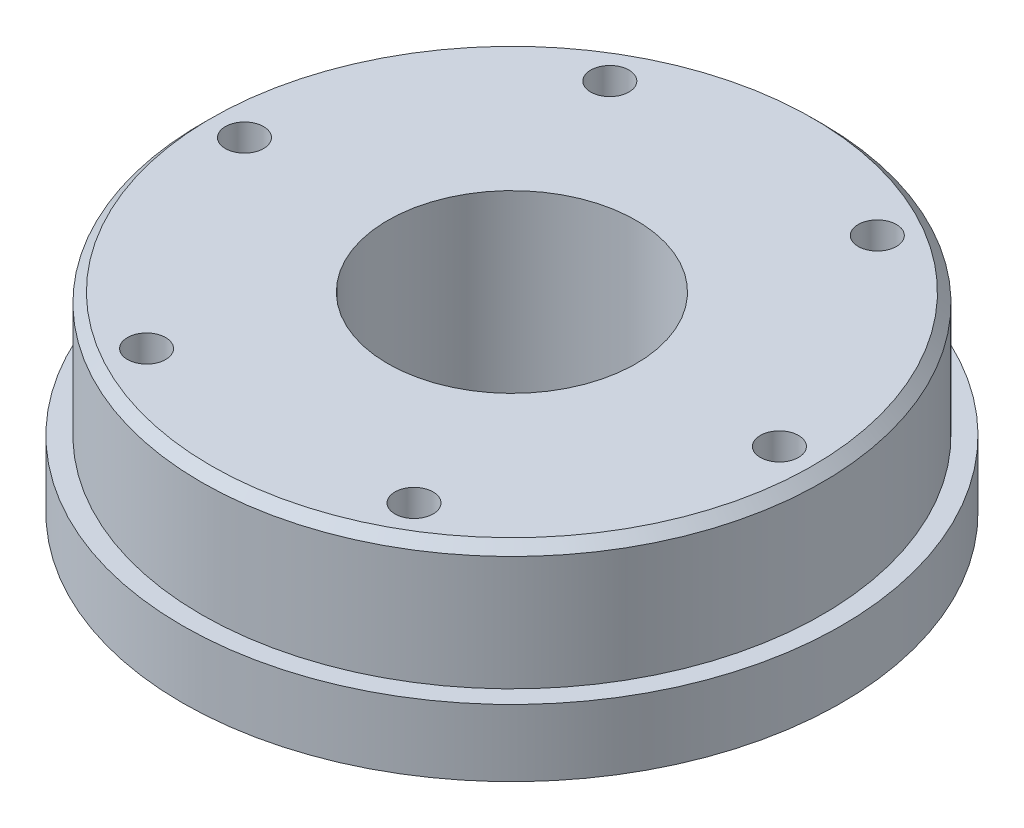
ISO-10303-21;
HEADER;
FILE_DESCRIPTION(('STEP AP214'),'2;1');
FILE_NAME('part.step','',(''),(''),'','','');
FILE_SCHEMA(('AUTOMOTIVE_DESIGN { 1 0 10303 214 1 1 1 1 }'));
ENDSEC;
DATA;
#1=APPLICATION_CONTEXT('core data for automotive mechanical design processes');
#2=APPLICATION_PROTOCOL_DEFINITION('international standard','automotive_design',2000,#1);
#3=PRODUCT_CONTEXT('',#1,'mechanical');
#4=PRODUCT('Part','Part','',(#3));
#5=PRODUCT_RELATED_PRODUCT_CATEGORY('part','',(#4));
#6=PRODUCT_DEFINITION_FORMATION('','',#4);
#7=PRODUCT_DEFINITION_CONTEXT('part definition',#1,'design');
#8=PRODUCT_DEFINITION('design','',#6,#7);
#9=PRODUCT_DEFINITION_SHAPE('','',#8);
#10=(LENGTH_UNIT() NAMED_UNIT(*) SI_UNIT(.MILLI.,.METRE.));
#11=(NAMED_UNIT(*) PLANE_ANGLE_UNIT() SI_UNIT($,.RADIAN.));
#12=(NAMED_UNIT(*) SI_UNIT($,.STERADIAN.) SOLID_ANGLE_UNIT());
#13=UNCERTAINTY_MEASURE_WITH_UNIT(LENGTH_MEASURE(1.E-05),#10,'distance_accuracy_value','');
#14=(GEOMETRIC_REPRESENTATION_CONTEXT(3) GLOBAL_UNCERTAINTY_ASSIGNED_CONTEXT((#13)) GLOBAL_UNIT_ASSIGNED_CONTEXT((#10,
#11,#12)) REPRESENTATION_CONTEXT('',''));
#15=CARTESIAN_POINT('',(0.,0.,0.));
#16=DIRECTION('',(0.,0.,1.));
#17=DIRECTION('',(1.,0.,0.));
#18=AXIS2_PLACEMENT_3D('',#15,#16,#17);
#19=CARTESIAN_POINT('',(-13.9999999999999,0.,-24.2487113059643));
#20=DIRECTION('',(0.,1.,0.));
#21=DIRECTION('',(0.,0.,1.));
#22=AXIS2_PLACEMENT_3D('',#19,#20,#21);
#23=CYLINDRICAL_SURFACE('',#22,2.);
#24=CARTESIAN_POINT('',(-13.9999999999999,20.,-24.2487113059643));
#25=DIRECTION('',(0.,1.,0.));
#26=DIRECTION('',(0.,0.,1.));
#27=AXIS2_PLACEMENT_3D('',#24,#25,#26);
#28=CIRCLE('',#27,2.);
#29=CARTESIAN_POINT('',(-13.9999999999999,20.,-22.2487113059643));
#30=VERTEX_POINT('',#29);
#31=EDGE_CURVE('E93',#30,#30,#28,.T.);
#32=ORIENTED_EDGE('',*,*,#31,.T.);
#33=EDGE_LOOP('',(#32));
#34=FACE_BOUND('',#33,.T.);
#35=CARTESIAN_POINT('',(-13.9999999999999,4.5,-24.2487113059643));
#36=DIRECTION('',(0.,-1.,0.));
#37=DIRECTION('',(0.,0.,-1.));
#38=AXIS2_PLACEMENT_3D('',#35,#36,#37);
#39=CIRCLE('',#38,2.);
#40=CARTESIAN_POINT('',(-13.9999999999999,4.5,-26.2487113059643));
#41=VERTEX_POINT('',#40);
#42=EDGE_CURVE('E57',#41,#41,#39,.F.);
#43=ORIENTED_EDGE('',*,*,#42,.F.);
#44=EDGE_LOOP('',(#43));
#45=FACE_BOUND('',#44,.T.);
#46=ADVANCED_FACE('F38',(#34,#45),#23,.F.);
#47=CARTESIAN_POINT('',(-14.0000000000003,0.,24.2487113059641));
#48=DIRECTION('',(0.,1.,0.));
#49=DIRECTION('',(0.,0.,1.));
#50=AXIS2_PLACEMENT_3D('',#47,#48,#49);
#51=CYLINDRICAL_SURFACE('',#50,2.);
#52=CARTESIAN_POINT('',(-14.0000000000003,20.,24.2487113059641));
#53=DIRECTION('',(0.,1.,0.));
#54=DIRECTION('',(0.,0.,1.));
#55=AXIS2_PLACEMENT_3D('',#52,#53,#54);
#56=CIRCLE('',#55,2.);
#57=CARTESIAN_POINT('',(-14.0000000000003,20.,26.2487113059641));
#58=VERTEX_POINT('',#57);
#59=EDGE_CURVE('E90',#58,#58,#56,.T.);
#60=ORIENTED_EDGE('',*,*,#59,.T.);
#61=EDGE_LOOP('',(#60));
#62=FACE_BOUND('',#61,.T.);
#63=CARTESIAN_POINT('',(-14.0000000000003,4.5,24.2487113059641));
#64=DIRECTION('',(0.,-1.,0.));
#65=DIRECTION('',(0.,0.,-1.));
#66=AXIS2_PLACEMENT_3D('',#63,#64,#65);
#67=CIRCLE('',#66,2.);
#68=CARTESIAN_POINT('',(-14.0000000000003,4.5,22.2487113059641));
#69=VERTEX_POINT('',#68);
#70=EDGE_CURVE('E61',#69,#69,#67,.F.);
#71=ORIENTED_EDGE('',*,*,#70,.F.);
#72=EDGE_LOOP('',(#71));
#73=FACE_BOUND('',#72,.T.);
#74=ADVANCED_FACE('F235',(#62,#73),#51,.F.);
#75=CARTESIAN_POINT('',(14.0000000000001,0.,-24.2487113059642));
#76=DIRECTION('',(0.,1.,0.));
#77=DIRECTION('',(0.,0.,1.));
#78=AXIS2_PLACEMENT_3D('',#75,#76,#77);
#79=CYLINDRICAL_SURFACE('',#78,2.);
#80=CARTESIAN_POINT('',(14.0000000000001,20.,-24.2487113059642));
#81=DIRECTION('',(0.,1.,0.));
#82=DIRECTION('',(0.,0.,1.));
#83=AXIS2_PLACEMENT_3D('',#80,#81,#82);
#84=CIRCLE('',#83,2.);
#85=CARTESIAN_POINT('',(14.0000000000001,20.,-22.2487113059642));
#86=VERTEX_POINT('',#85);
#87=EDGE_CURVE('E86',#86,#86,#84,.T.);
#88=ORIENTED_EDGE('',*,*,#87,.T.);
#89=EDGE_LOOP('',(#88));
#90=FACE_BOUND('',#89,.T.);
#91=CARTESIAN_POINT('',(14.0000000000001,4.5,-24.2487113059642));
#92=DIRECTION('',(0.,-1.,0.));
#93=DIRECTION('',(0.,0.,-1.));
#94=AXIS2_PLACEMENT_3D('',#91,#92,#93);
#95=CIRCLE('',#94,2.);
#96=CARTESIAN_POINT('',(14.0000000000001,4.5,-26.2487113059642));
#97=VERTEX_POINT('',#96);
#98=EDGE_CURVE('E64',#97,#97,#95,.F.);
#99=ORIENTED_EDGE('',*,*,#98,.F.);
#100=EDGE_LOOP('',(#99));
#101=FACE_BOUND('',#100,.T.);
#102=ADVANCED_FACE('F241',(#90,#101),#79,.F.);
#103=CARTESIAN_POINT('',(28.,0.,1.95522954975215E-13));
#104=DIRECTION('',(0.,1.,0.));
#105=DIRECTION('',(0.,0.,1.));
#106=AXIS2_PLACEMENT_3D('',#103,#104,#105);
#107=CYLINDRICAL_SURFACE('',#106,2.);
#108=CARTESIAN_POINT('',(28.,20.,1.95522954975215E-13));
#109=DIRECTION('',(0.,1.,0.));
#110=DIRECTION('',(0.,0.,1.));
#111=AXIS2_PLACEMENT_3D('',#108,#109,#110);
#112=CIRCLE('',#111,2.);
#113=CARTESIAN_POINT('',(28.,20.,2.00000000000019));
#114=VERTEX_POINT('',#113);
#115=EDGE_CURVE('E83',#114,#114,#112,.T.);
#116=ORIENTED_EDGE('',*,*,#115,.T.);
#117=EDGE_LOOP('',(#116));
#118=FACE_BOUND('',#117,.T.);
#119=CARTESIAN_POINT('',(28.,4.5,1.95522954975215E-13));
#120=DIRECTION('',(0.,-1.,0.));
#121=DIRECTION('',(0.,0.,-1.));
#122=AXIS2_PLACEMENT_3D('',#119,#120,#121);
#123=CIRCLE('',#122,2.);
#124=CARTESIAN_POINT('',(28.,4.5,-1.9999999999998));
#125=VERTEX_POINT('',#124);
#126=EDGE_CURVE('E67',#125,#125,#123,.F.);
#127=ORIENTED_EDGE('',*,*,#126,.F.);
#128=EDGE_LOOP('',(#127));
#129=FACE_BOUND('',#128,.T.);
#130=ADVANCED_FACE('F251',(#118,#129),#107,.F.);
#131=CARTESIAN_POINT('',(13.9999999999998,0.,24.2487113059644));
#132=DIRECTION('',(0.,1.,0.));
#133=DIRECTION('',(0.,0.,1.));
#134=AXIS2_PLACEMENT_3D('',#131,#132,#133);
#135=CYLINDRICAL_SURFACE('',#134,2.);
#136=CARTESIAN_POINT('',(13.9999999999998,20.,24.2487113059644));
#137=DIRECTION('',(0.,1.,0.));
#138=DIRECTION('',(0.,0.,1.));
#139=AXIS2_PLACEMENT_3D('',#136,#137,#138);
#140=CIRCLE('',#139,2.);
#141=CARTESIAN_POINT('',(13.9999999999998,20.,26.2487113059644));
#142=VERTEX_POINT('',#141);
#143=EDGE_CURVE('E87',#142,#142,#140,.T.);
#144=ORIENTED_EDGE('',*,*,#143,.T.);
#145=EDGE_LOOP('',(#144));
#146=FACE_BOUND('',#145,.T.);
#147=CARTESIAN_POINT('',(13.9999999999998,4.5,24.2487113059644));
#148=DIRECTION('',(0.,-1.,0.));
#149=DIRECTION('',(0.,0.,-1.));
#150=AXIS2_PLACEMENT_3D('',#147,#148,#149);
#151=CIRCLE('',#150,2.);
#152=CARTESIAN_POINT('',(13.9999999999998,4.5,22.2487113059644));
#153=VERTEX_POINT('',#152);
#154=EDGE_CURVE('E70',#153,#153,#151,.F.);
#155=ORIENTED_EDGE('',*,*,#154,.F.);
#156=EDGE_LOOP('',(#155));
#157=FACE_BOUND('',#156,.T.);
#158=ADVANCED_FACE('F246',(#146,#157),#135,.F.);
#159=CARTESIAN_POINT('',(-28.,0.,0.));
#160=DIRECTION('',(0.,1.,0.));
#161=DIRECTION('',(0.,0.,1.));
#162=AXIS2_PLACEMENT_3D('',#159,#160,#161);
#163=CYLINDRICAL_SURFACE('',#162,2.);
#164=CARTESIAN_POINT('',(-28.,20.,0.));
#165=DIRECTION('',(0.,1.,0.));
#166=DIRECTION('',(0.,0.,1.));
#167=AXIS2_PLACEMENT_3D('',#164,#165,#166);
#168=CIRCLE('',#167,2.);
#169=CARTESIAN_POINT('',(-28.,20.,2.));
#170=VERTEX_POINT('',#169);
#171=EDGE_CURVE('E82',#170,#170,#168,.T.);
#172=ORIENTED_EDGE('',*,*,#171,.T.);
#173=EDGE_LOOP('',(#172));
#174=FACE_BOUND('',#173,.T.);
#175=CARTESIAN_POINT('',(-28.,4.5,0.));
#176=DIRECTION('',(0.,-1.,0.));
#177=DIRECTION('',(0.,0.,-1.));
#178=AXIS2_PLACEMENT_3D('',#175,#176,#177);
#179=CIRCLE('',#178,2.);
#180=CARTESIAN_POINT('',(-28.,4.5,-2.));
#181=VERTEX_POINT('',#180);
#182=EDGE_CURVE('E73',#181,#181,#179,.F.);
#183=ORIENTED_EDGE('',*,*,#182,.F.);
#184=EDGE_LOOP('',(#183));
#185=FACE_BOUND('',#184,.T.);
#186=ADVANCED_FACE('F220',(#174,#185),#163,.F.);
#187=CARTESIAN_POINT('',(0.,20.,0.));
#188=DIRECTION('',(0.,-1.,0.));
#189=DIRECTION('',(0.,0.,-1.));
#190=AXIS2_PLACEMENT_3D('',#187,#188,#189);
#191=CYLINDRICAL_SURFACE('',#190,34.5);
#192=CARTESIAN_POINT('',(0.,0.,0.));
#193=DIRECTION('',(0.,1.,0.));
#194=DIRECTION('',(0.,0.,1.));
#195=AXIS2_PLACEMENT_3D('',#192,#193,#194);
#196=CIRCLE('',#195,34.5);
#197=CARTESIAN_POINT('',(0.,0.,34.5));
#198=VERTEX_POINT('',#197);
#199=EDGE_CURVE('E50',#198,#198,#196,.T.);
#200=ORIENTED_EDGE('',*,*,#199,.T.);
#201=EDGE_LOOP('',(#200));
#202=FACE_BOUND('',#201,.T.);
#203=CARTESIAN_POINT('',(0.,7.,0.));
#204=DIRECTION('',(0.,1.,0.));
#205=DIRECTION('',(0.,0.,1.));
#206=AXIS2_PLACEMENT_3D('',#203,#204,#205);
#207=CIRCLE('',#206,34.5);
#208=CARTESIAN_POINT('',(0.,7.,34.5));
#209=VERTEX_POINT('',#208);
#210=EDGE_CURVE('E54',#209,#209,#207,.T.);
#211=ORIENTED_EDGE('',*,*,#210,.F.);
#212=EDGE_LOOP('',(#211));
#213=FACE_BOUND('',#212,.T.);
#214=ADVANCED_FACE('F190',(#202,#213),#191,.T.);
#215=CARTESIAN_POINT('',(0.,0.,0.));
#216=DIRECTION('',(0.,1.,0.));
#217=DIRECTION('',(0.,0.,1.));
#218=AXIS2_PLACEMENT_3D('',#215,#216,#217);
#219=PLANE('',#218);
#220=CARTESIAN_POINT('',(0.,0.,28.));
#221=DIRECTION('',(0.,-1.,0.));
#222=DIRECTION('',(0.,0.,-1.));
#223=AXIS2_PLACEMENT_3D('',#220,#221,#222);
#224=CIRCLE('',#223,2.);
#225=CARTESIAN_POINT('',(0.,0.,26.));
#226=VERTEX_POINT('',#225);
#227=EDGE_CURVE('E166',#226,#226,#224,.T.);
#228=ORIENTED_EDGE('',*,*,#227,.F.);
#229=EDGE_LOOP('',(#228));
#230=FACE_BOUND('',#229,.T.);
#231=CARTESIAN_POINT('',(-24.2487113059639,0.,13.9999999999993));
#232=DIRECTION('',(0.,-1.,0.));
#233=DIRECTION('',(0.,0.,-1.));
#234=AXIS2_PLACEMENT_3D('',#231,#232,#233);
#235=CIRCLE('',#234,2.00000000000091);
#236=CARTESIAN_POINT('',(-24.2487113059639,0.,11.9999999999984));
#237=VERTEX_POINT('',#236);
#238=EDGE_CURVE('E167',#237,#237,#235,.T.);
#239=ORIENTED_EDGE('',*,*,#238,.F.);
#240=EDGE_LOOP('',(#239));
#241=FACE_BOUND('',#240,.T.);
#242=CARTESIAN_POINT('',(-24.2487113059631,0.,-14.0000000000007));
#243=DIRECTION('',(0.,-1.,0.));
#244=DIRECTION('',(0.,0.,-1.));
#245=AXIS2_PLACEMENT_3D('',#242,#243,#244);
#246=CIRCLE('',#245,2.00000000000159);
#247=CARTESIAN_POINT('',(-24.2487113059631,0.,-16.0000000000023));
#248=VERTEX_POINT('',#247);
#249=EDGE_CURVE('E141',#248,#248,#246,.T.);
#250=ORIENTED_EDGE('',*,*,#249,.F.);
#251=EDGE_LOOP('',(#250));
#252=FACE_BOUND('',#251,.T.);
#253=CARTESIAN_POINT('',(1.58132869498979E-12,0.,-28.));
#254=DIRECTION('',(0.,-1.,0.));
#255=DIRECTION('',(0.,0.,-1.));
#256=AXIS2_PLACEMENT_3D('',#253,#254,#255);
#257=CIRCLE('',#256,2.0000000000017);
#258=CARTESIAN_POINT('',(1.58132869498979E-12,0.,-30.0000000000017));
#259=VERTEX_POINT('',#258);
#260=EDGE_CURVE('E148',#259,#259,#257,.T.);
#261=ORIENTED_EDGE('',*,*,#260,.F.);
#262=EDGE_LOOP('',(#261));
#263=FACE_BOUND('',#262,.T.);
#264=CARTESIAN_POINT('',(24.2487113059655,0.,-13.9999999999993));
#265=DIRECTION('',(0.,-1.,0.));
#266=DIRECTION('',(0.,0.,-1.));
#267=AXIS2_PLACEMENT_3D('',#264,#265,#266);
#268=CIRCLE('',#267,2.00000000000106);
#269=CARTESIAN_POINT('',(24.2487113059655,0.,-16.0000000000004));
#270=VERTEX_POINT('',#269);
#271=EDGE_CURVE('E154',#270,#270,#268,.T.);
#272=ORIENTED_EDGE('',*,*,#271,.F.);
#273=EDGE_LOOP('',(#272));
#274=FACE_BOUND('',#273,.T.);
#275=CARTESIAN_POINT('',(24.2487113059647,0.,14.0000000000007));
#276=DIRECTION('',(0.,-1.,0.));
#277=DIRECTION('',(0.,0.,-1.));
#278=AXIS2_PLACEMENT_3D('',#275,#276,#277);
#279=CIRCLE('',#278,2.00000000000025);
#280=CARTESIAN_POINT('',(24.2487113059647,0.,12.0000000000004));
#281=VERTEX_POINT('',#280);
#282=EDGE_CURVE('E160',#281,#281,#279,.T.);
#283=ORIENTED_EDGE('',*,*,#282,.F.);
#284=EDGE_LOOP('',(#283));
#285=FACE_BOUND('',#284,.T.);
#286=CARTESIAN_POINT('',(-28.,0.,0.));
#287=DIRECTION('',(0.,-1.,0.));
#288=DIRECTION('',(0.,0.,-1.));
#289=AXIS2_PLACEMENT_3D('',#286,#287,#288);
#290=CIRCLE('',#289,3.75);
#291=CARTESIAN_POINT('',(-28.,0.,-3.75));
#292=VERTEX_POINT('',#291);
#293=EDGE_CURVE('E130',#292,#292,#290,.T.);
#294=ORIENTED_EDGE('',*,*,#293,.F.);
#295=EDGE_LOOP('',(#294));
#296=FACE_BOUND('',#295,.T.);
#297=CARTESIAN_POINT('',(-14.0000000000003,0.,-24.2487113059641));
#298=DIRECTION('',(0.,-1.,0.));
#299=DIRECTION('',(0.,0.,-1.));
#300=AXIS2_PLACEMENT_3D('',#297,#298,#299);
#301=CIRCLE('',#300,3.75);
#302=CARTESIAN_POINT('',(-14.0000000000003,0.,-27.9987113059641));
#303=VERTEX_POINT('',#302);
#304=EDGE_CURVE('E131',#303,#303,#301,.T.);
#305=ORIENTED_EDGE('',*,*,#304,.F.);
#306=EDGE_LOOP('',(#305));
#307=FACE_BOUND('',#306,.T.);
#308=CARTESIAN_POINT('',(13.9999999999998,0.,-24.2487113059644));
#309=DIRECTION('',(0.,-1.,0.));
#310=DIRECTION('',(0.,0.,-1.));
#311=AXIS2_PLACEMENT_3D('',#308,#309,#310);
#312=CIRCLE('',#311,3.75);
#313=CARTESIAN_POINT('',(13.9999999999998,0.,-27.9987113059644));
#314=VERTEX_POINT('',#313);
#315=EDGE_CURVE('E105',#314,#314,#312,.T.);
#316=ORIENTED_EDGE('',*,*,#315,.F.);
#317=EDGE_LOOP('',(#316));
#318=FACE_BOUND('',#317,.T.);
#319=CARTESIAN_POINT('',(28.,0.,-1.95522954975215E-13));
#320=DIRECTION('',(0.,-1.,0.));
#321=DIRECTION('',(0.,0.,-1.));
#322=AXIS2_PLACEMENT_3D('',#319,#320,#321);
#323=CIRCLE('',#322,3.75);
#324=CARTESIAN_POINT('',(28.,0.,-3.75000000000019));
#325=VERTEX_POINT('',#324);
#326=EDGE_CURVE('E112',#325,#325,#323,.T.);
#327=ORIENTED_EDGE('',*,*,#326,.F.);
#328=EDGE_LOOP('',(#327));
#329=FACE_BOUND('',#328,.T.);
#330=CARTESIAN_POINT('',(14.0000000000001,0.,24.2487113059642));
#331=DIRECTION('',(0.,-1.,0.));
#332=DIRECTION('',(0.,0.,-1.));
#333=AXIS2_PLACEMENT_3D('',#330,#331,#332);
#334=CIRCLE('',#333,3.75);
#335=CARTESIAN_POINT('',(14.0000000000001,0.,20.4987113059642));
#336=VERTEX_POINT('',#335);
#337=EDGE_CURVE('E118',#336,#336,#334,.T.);
#338=ORIENTED_EDGE('',*,*,#337,.F.);
#339=EDGE_LOOP('',(#338));
#340=FACE_BOUND('',#339,.T.);
#341=CARTESIAN_POINT('',(-13.9999999999999,0.,24.2487113059643));
#342=DIRECTION('',(0.,-1.,0.));
#343=DIRECTION('',(0.,0.,-1.));
#344=AXIS2_PLACEMENT_3D('',#341,#342,#343);
#345=CIRCLE('',#344,3.75);
#346=CARTESIAN_POINT('',(-13.9999999999999,0.,20.4987113059643));
#347=VERTEX_POINT('',#346);
#348=EDGE_CURVE('E124',#347,#347,#345,.T.);
#349=ORIENTED_EDGE('',*,*,#348,.F.);
#350=EDGE_LOOP('',(#349));
#351=FACE_BOUND('',#350,.T.);
#352=CARTESIAN_POINT('',(0.,0.,0.));
#353=DIRECTION('',(0.,1.,0.));
#354=DIRECTION('',(0.,0.,1.));
#355=AXIS2_PLACEMENT_3D('',#352,#353,#354);
#356=CIRCLE('',#355,13.);
#357=CARTESIAN_POINT('',(0.,0.,13.));
#358=VERTEX_POINT('',#357);
#359=EDGE_CURVE('E98',#358,#358,#356,.T.);
#360=ORIENTED_EDGE('',*,*,#359,.T.);
#361=EDGE_LOOP('',(#360));
#362=FACE_BOUND('',#361,.T.);
#363=ORIENTED_EDGE('',*,*,#199,.F.);
#364=EDGE_LOOP('',(#363));
#365=FACE_BOUND('',#364,.T.);
#366=ADVANCED_FACE('F186',(#230,#241,#252,#263,#274,#285,#296,#307,#318,#329,#340,#351,#362,
#365),#219,.F.);
#367=CARTESIAN_POINT('',(0.,7.,0.));
#368=DIRECTION('',(0.,1.,0.));
#369=DIRECTION('',(0.,0.,1.));
#370=AXIS2_PLACEMENT_3D('',#367,#368,#369);
#371=PLANE('',#370);
#372=CARTESIAN_POINT('',(0.,7.,0.));
#373=DIRECTION('',(0.,1.,0.));
#374=DIRECTION('',(0.,0.,1.));
#375=AXIS2_PLACEMENT_3D('',#372,#373,#374);
#376=CIRCLE('',#375,32.5);
#377=CARTESIAN_POINT('',(0.,7.,32.5));
#378=VERTEX_POINT('',#377);
#379=EDGE_CURVE('E79',#378,#378,#376,.T.);
#380=ORIENTED_EDGE('',*,*,#379,.F.);
#381=EDGE_LOOP('',(#380));
#382=FACE_BOUND('',#381,.T.);
#383=ORIENTED_EDGE('',*,*,#210,.T.);
#384=EDGE_LOOP('',(#383));
#385=FACE_BOUND('',#384,.T.);
#386=ADVANCED_FACE('F189',(#382,#385),#371,.T.);
#387=CARTESIAN_POINT('',(0.,7.,0.));
#388=DIRECTION('',(0.,1.,0.));
#389=DIRECTION('',(0.,0.,1.));
#390=AXIS2_PLACEMENT_3D('',#387,#388,#389);
#391=CYLINDRICAL_SURFACE('',#390,32.5);
#392=CARTESIAN_POINT('',(0.,19.,0.));
#393=DIRECTION('',(0.,1.,0.));
#394=DIRECTION('',(0.,0.,1.));
#395=AXIS2_PLACEMENT_3D('',#392,#393,#394);
#396=CIRCLE('',#395,32.5);
#397=CARTESIAN_POINT('',(0.,19.,32.5));
#398=VERTEX_POINT('',#397);
#399=EDGE_CURVE('E10',#398,#398,#396,.F.);
#400=CARTESIAN_POINT('',(0.,19.,32.5));
#401=CARTESIAN_POINT('',(0.,18.875,32.5));
#402=CARTESIAN_POINT('',(0.,18.75,32.5));
#403=CARTESIAN_POINT('',(0.,18.5,32.5));
#404=CARTESIAN_POINT('',(0.,18.375,32.5));
#405=CARTESIAN_POINT('',(0.,18.125,32.5));
#406=CARTESIAN_POINT('',(0.,18.,32.5));
#407=CARTESIAN_POINT('',(0.,17.75,32.5));
#408=CARTESIAN_POINT('',(0.,17.625,32.5));
#409=CARTESIAN_POINT('',(0.,17.375,32.5));
#410=CARTESIAN_POINT('',(0.,17.25,32.5));
#411=CARTESIAN_POINT('',(0.,17.,32.5));
#412=CARTESIAN_POINT('',(0.,16.875,32.5));
#413=CARTESIAN_POINT('',(0.,16.625,32.5));
#414=CARTESIAN_POINT('',(0.,16.5,32.5));
#415=CARTESIAN_POINT('',(0.,16.25,32.5));
#416=CARTESIAN_POINT('',(0.,16.125,32.5));
#417=CARTESIAN_POINT('',(0.,15.875,32.5));
#418=CARTESIAN_POINT('',(0.,15.75,32.5));
#419=CARTESIAN_POINT('',(0.,15.5,32.5));
#420=CARTESIAN_POINT('',(0.,15.375,32.5));
#421=CARTESIAN_POINT('',(0.,15.125,32.5));
#422=CARTESIAN_POINT('',(0.,15.,32.5));
#423=CARTESIAN_POINT('',(0.,14.75,32.5));
#424=CARTESIAN_POINT('',(0.,14.625,32.5));
#425=CARTESIAN_POINT('',(0.,14.375,32.5));
#426=CARTESIAN_POINT('',(0.,14.25,32.5));
#427=CARTESIAN_POINT('',(0.,14.,32.5));
#428=CARTESIAN_POINT('',(0.,13.875,32.5));
#429=CARTESIAN_POINT('',(0.,13.625,32.5));
#430=CARTESIAN_POINT('',(0.,13.5,32.5));
#431=CARTESIAN_POINT('',(0.,13.25,32.5));
#432=CARTESIAN_POINT('',(0.,13.125,32.5));
#433=CARTESIAN_POINT('',(0.,12.875,32.5));
#434=CARTESIAN_POINT('',(0.,12.75,32.5));
#435=CARTESIAN_POINT('',(0.,12.5,32.5));
#436=CARTESIAN_POINT('',(0.,12.375,32.5));
#437=CARTESIAN_POINT('',(0.,12.125,32.5));
#438=CARTESIAN_POINT('',(0.,12.,32.5));
#439=CARTESIAN_POINT('',(0.,11.75,32.5));
#440=CARTESIAN_POINT('',(0.,11.625,32.5));
#441=CARTESIAN_POINT('',(0.,11.375,32.5));
#442=CARTESIAN_POINT('',(0.,11.25,32.5));
#443=CARTESIAN_POINT('',(0.,11.,32.5));
#444=CARTESIAN_POINT('',(0.,10.875,32.5));
#445=CARTESIAN_POINT('',(0.,10.625,32.5));
#446=CARTESIAN_POINT('',(0.,10.5,32.5));
#447=CARTESIAN_POINT('',(0.,10.25,32.5));
#448=CARTESIAN_POINT('',(0.,10.125,32.5));
#449=CARTESIAN_POINT('',(0.,9.87500000000001,32.5));
#450=CARTESIAN_POINT('',(0.,9.75000000000001,32.5));
#451=CARTESIAN_POINT('',(0.,9.50000000000001,32.5));
#452=CARTESIAN_POINT('',(0.,9.37500000000001,32.5));
#453=CARTESIAN_POINT('',(0.,9.12500000000001,32.5));
#454=CARTESIAN_POINT('',(0.,9.00000000000001,32.5));
#455=CARTESIAN_POINT('',(0.,8.75000000000001,32.5));
#456=CARTESIAN_POINT('',(0.,8.62500000000001,32.5));
#457=CARTESIAN_POINT('',(0.,8.37500000000001,32.5));
#458=CARTESIAN_POINT('',(0.,8.25000000000001,32.5));
#459=CARTESIAN_POINT('',(0.,8.00000000000001,32.5));
#460=CARTESIAN_POINT('',(0.,7.875,32.5));
#461=CARTESIAN_POINT('',(0.,7.625,32.5));
#462=CARTESIAN_POINT('',(0.,7.5,32.5));
#463=CARTESIAN_POINT('',(0.,7.25,32.5));
#464=CARTESIAN_POINT('',(0.,7.125,32.5));
#465=CARTESIAN_POINT('',(0.,7.,32.5));
#466=B_SPLINE_CURVE_WITH_KNOTS('',3,(#400,#401,#402,#403,#404,#405,#406,#407,#408,#409,#410,
#411,#412,#413,#414,#415,#416,#417,#418,#419,#420,#421,#422,#423,#424,#425,#426,#427,#428,#429,
#430,#431,#432,#433,#434,#435,#436,#437,#438,#439,#440,#441,#442,#443,#444,#445,#446,#447,#448,
#449,#450,#451,#452,#453,#454,#455,#456,#457,#458,#459,#460,#461,#462,#463,#464,#465),
.UNSPECIFIED.,.F.,.F.,(4,2,2,2,2,2,2,2,2,2,2,2,2,2,2,2,2,2,2,2,2,2,2,2,2,2,2,2,2,2,2,2,4),(0.,
0.375000000000004,0.750000000000004,1.125,1.5,1.87500000000001,2.25000000000001,
2.62500000000001,3.00000000000001,3.37500000000001,3.75000000000002,4.12500000000002,
4.50000000000002,4.87500000000002,5.25000000000002,5.62500000000002,6.00000000000002,
6.37500000000002,6.75000000000003,7.12500000000003,7.50000000000003,7.87500000000003,
8.25000000000003,8.62500000000003,9.00000000000003,9.37500000000004,9.75000000000004,10.125,
10.5,10.875,11.25,11.625,12.),.UNSPECIFIED.);
#467=EDGE_CURVE('BSEAM224',#398,#378,#466,.T.);
#468=ORIENTED_EDGE('',*,*,#399,.T.);
#469=ORIENTED_EDGE('',*,*,#379,.T.);
#470=ORIENTED_EDGE('',*,*,#467,.T.);
#471=ORIENTED_EDGE('',*,*,#467,.F.);
#472=EDGE_LOOP('',(#468,#470,#469,#471));
#473=FACE_BOUND('',#472,.T.);
#474=ADVANCED_FACE('F224',(#473),#391,.T.);
#475=CARTESIAN_POINT('',(0.,20.,0.));
#476=DIRECTION('',(0.,1.,0.));
#477=DIRECTION('',(0.,0.,1.));
#478=AXIS2_PLACEMENT_3D('',#475,#476,#477);
#479=PLANE('',#478);
#480=CARTESIAN_POINT('',(0.,20.,0.));
#481=DIRECTION('',(0.,1.,0.));
#482=DIRECTION('',(0.,0.,1.));
#483=AXIS2_PLACEMENT_3D('',#480,#481,#482);
#484=CIRCLE('',#483,31.5);
#485=CARTESIAN_POINT('',(0.,20.,31.5));
#486=VERTEX_POINT('',#485);
#487=EDGE_CURVE('E46',#486,#486,#484,.T.);
#488=ORIENTED_EDGE('',*,*,#487,.T.);
#489=EDGE_LOOP('',(#488));
#490=FACE_BOUND('',#489,.T.);
#491=CARTESIAN_POINT('',(0.,20.,0.));
#492=DIRECTION('',(0.,1.,0.));
#493=DIRECTION('',(0.,0.,1.));
#494=AXIS2_PLACEMENT_3D('',#491,#492,#493);
#495=CIRCLE('',#494,13.);
#496=CARTESIAN_POINT('',(0.,20.,13.));
#497=VERTEX_POINT('',#496);
#498=EDGE_CURVE('E60',#497,#497,#495,.T.);
#499=ORIENTED_EDGE('',*,*,#498,.F.);
#500=EDGE_LOOP('',(#499));
#501=FACE_BOUND('',#500,.T.);
#502=ORIENTED_EDGE('',*,*,#171,.F.);
#503=EDGE_LOOP('',(#502));
#504=FACE_BOUND('',#503,.T.);
#505=ORIENTED_EDGE('',*,*,#143,.F.);
#506=EDGE_LOOP('',(#505));
#507=FACE_BOUND('',#506,.T.);
#508=ORIENTED_EDGE('',*,*,#115,.F.);
#509=EDGE_LOOP('',(#508));
#510=FACE_BOUND('',#509,.T.);
#511=ORIENTED_EDGE('',*,*,#87,.F.);
#512=EDGE_LOOP('',(#511));
#513=FACE_BOUND('',#512,.T.);
#514=ORIENTED_EDGE('',*,*,#59,.F.);
#515=EDGE_LOOP('',(#514));
#516=FACE_BOUND('',#515,.T.);
#517=ORIENTED_EDGE('',*,*,#31,.F.);
#518=EDGE_LOOP('',(#517));
#519=FACE_BOUND('',#518,.T.);
#520=ADVANCED_FACE('F230',(#490,#501,#504,#507,#510,#513,#516,#519),#479,.T.);
#521=CARTESIAN_POINT('',(0.,0.,0.));
#522=DIRECTION('',(0.,1.,0.));
#523=DIRECTION('',(0.,0.,1.));
#524=AXIS2_PLACEMENT_3D('',#521,#522,#523);
#525=CYLINDRICAL_SURFACE('',#524,13.);
#526=ORIENTED_EDGE('',*,*,#359,.F.);
#527=EDGE_LOOP('',(#526));
#528=FACE_BOUND('',#527,.T.);
#529=ORIENTED_EDGE('',*,*,#498,.T.);
#530=EDGE_LOOP('',(#529));
#531=FACE_BOUND('',#530,.T.);
#532=ADVANCED_FACE('F289',(#528,#531),#525,.F.);
#533=CARTESIAN_POINT('',(-28.,4.5,0.));
#534=DIRECTION('',(0.,-1.,0.));
#535=DIRECTION('',(0.,0.,-1.));
#536=AXIS2_PLACEMENT_3D('',#533,#534,#535);
#537=PLANE('',#536);
#538=CARTESIAN_POINT('',(-28.,4.5,0.));
#539=DIRECTION('',(0.,-1.,0.));
#540=DIRECTION('',(0.,0.,-1.));
#541=AXIS2_PLACEMENT_3D('',#538,#539,#540);
#542=CIRCLE('',#541,3.75);
#543=CARTESIAN_POINT('',(-28.,4.5,-3.75));
#544=VERTEX_POINT('',#543);
#545=EDGE_CURVE('E75',#544,#544,#542,.T.);
#546=ORIENTED_EDGE('',*,*,#545,.T.);
#547=EDGE_LOOP('',(#546));
#548=FACE_BOUND('',#547,.T.);
#549=ORIENTED_EDGE('',*,*,#182,.T.);
#550=EDGE_LOOP('',(#549));
#551=FACE_BOUND('',#550,.T.);
#552=ADVANCED_FACE('F291',(#548,#551),#537,.T.);
#553=CARTESIAN_POINT('',(-28.,4.5,0.));
#554=DIRECTION('',(0.,-1.,0.));
#555=DIRECTION('',(0.,0.,-1.));
#556=AXIS2_PLACEMENT_3D('',#553,#554,#555);
#557=CYLINDRICAL_SURFACE('',#556,3.75);
#558=ORIENTED_EDGE('',*,*,#545,.F.);
#559=EDGE_LOOP('',(#558));
#560=FACE_BOUND('',#559,.T.);
#561=ORIENTED_EDGE('',*,*,#293,.T.);
#562=EDGE_LOOP('',(#561));
#563=FACE_BOUND('',#562,.T.);
#564=ADVANCED_FACE('F302',(#560,#563),#557,.F.);
#565=CARTESIAN_POINT('',(14.0000000000001,4.5,24.2487113059642));
#566=DIRECTION('',(0.,-1.,0.));
#567=DIRECTION('',(0.,0.,-1.));
#568=AXIS2_PLACEMENT_3D('',#565,#566,#567);
#569=PLANE('',#568);
#570=CARTESIAN_POINT('',(14.0000000000001,4.5,24.2487113059642));
#571=DIRECTION('',(0.,-1.,0.));
#572=DIRECTION('',(0.,0.,-1.));
#573=AXIS2_PLACEMENT_3D('',#570,#571,#572);
#574=CIRCLE('',#573,3.75);
#575=CARTESIAN_POINT('',(14.0000000000001,4.5,20.4987113059642));
#576=VERTEX_POINT('',#575);
#577=EDGE_CURVE('E121',#576,#576,#574,.T.);
#578=ORIENTED_EDGE('',*,*,#577,.T.);
#579=EDGE_LOOP('',(#578));
#580=FACE_BOUND('',#579,.T.);
#581=ORIENTED_EDGE('',*,*,#154,.T.);
#582=EDGE_LOOP('',(#581));
#583=FACE_BOUND('',#582,.T.);
#584=ADVANCED_FACE('F276',(#580,#583),#569,.T.);
#585=CARTESIAN_POINT('',(14.0000000000001,4.5,24.2487113059642));
#586=DIRECTION('',(0.,-1.,0.));
#587=DIRECTION('',(0.,0.,-1.));
#588=AXIS2_PLACEMENT_3D('',#585,#586,#587);
#589=CYLINDRICAL_SURFACE('',#588,3.75);
#590=ORIENTED_EDGE('',*,*,#577,.F.);
#591=EDGE_LOOP('',(#590));
#592=FACE_BOUND('',#591,.T.);
#593=ORIENTED_EDGE('',*,*,#337,.T.);
#594=EDGE_LOOP('',(#593));
#595=FACE_BOUND('',#594,.T.);
#596=ADVANCED_FACE('F266',(#592,#595),#589,.F.);
#597=CARTESIAN_POINT('',(28.,4.5,-1.95522954975215E-13));
#598=DIRECTION('',(0.,-1.,0.));
#599=DIRECTION('',(0.,0.,-1.));
#600=AXIS2_PLACEMENT_3D('',#597,#598,#599);
#601=PLANE('',#600);
#602=CARTESIAN_POINT('',(28.,4.5,-1.95522954975215E-13));
#603=DIRECTION('',(0.,-1.,0.));
#604=DIRECTION('',(0.,0.,-1.));
#605=AXIS2_PLACEMENT_3D('',#602,#603,#604);
#606=CIRCLE('',#605,3.75);
#607=CARTESIAN_POINT('',(28.,4.5,-3.75000000000019));
#608=VERTEX_POINT('',#607);
#609=EDGE_CURVE('E115',#608,#608,#606,.T.);
#610=ORIENTED_EDGE('',*,*,#609,.T.);
#611=EDGE_LOOP('',(#610));
#612=FACE_BOUND('',#611,.T.);
#613=ORIENTED_EDGE('',*,*,#126,.T.);
#614=EDGE_LOOP('',(#613));
#615=FACE_BOUND('',#614,.T.);
#616=ADVANCED_FACE('F263',(#612,#615),#601,.T.);
#617=CARTESIAN_POINT('',(28.,4.5,-1.95522954975215E-13));
#618=DIRECTION('',(0.,-1.,0.));
#619=DIRECTION('',(0.,0.,-1.));
#620=AXIS2_PLACEMENT_3D('',#617,#618,#619);
#621=CYLINDRICAL_SURFACE('',#620,3.75);
#622=ORIENTED_EDGE('',*,*,#609,.F.);
#623=EDGE_LOOP('',(#622));
#624=FACE_BOUND('',#623,.T.);
#625=ORIENTED_EDGE('',*,*,#326,.T.);
#626=EDGE_LOOP('',(#625));
#627=FACE_BOUND('',#626,.T.);
#628=ADVANCED_FACE('F265',(#624,#627),#621,.F.);
#629=CARTESIAN_POINT('',(13.9999999999998,4.5,-24.2487113059644));
#630=DIRECTION('',(0.,-1.,0.));
#631=DIRECTION('',(0.,0.,-1.));
#632=AXIS2_PLACEMENT_3D('',#629,#630,#631);
#633=PLANE('',#632);
#634=CARTESIAN_POINT('',(13.9999999999998,4.5,-24.2487113059644));
#635=DIRECTION('',(0.,-1.,0.));
#636=DIRECTION('',(0.,0.,-1.));
#637=AXIS2_PLACEMENT_3D('',#634,#635,#636);
#638=CIRCLE('',#637,3.75);
#639=CARTESIAN_POINT('',(13.9999999999998,4.5,-27.9987113059644));
#640=VERTEX_POINT('',#639);
#641=EDGE_CURVE('E108',#640,#640,#638,.T.);
#642=ORIENTED_EDGE('',*,*,#641,.T.);
#643=EDGE_LOOP('',(#642));
#644=FACE_BOUND('',#643,.T.);
#645=ORIENTED_EDGE('',*,*,#98,.T.);
#646=EDGE_LOOP('',(#645));
#647=FACE_BOUND('',#646,.T.);
#648=ADVANCED_FACE('F273',(#644,#647),#633,.T.);
#649=CARTESIAN_POINT('',(13.9999999999998,4.5,-24.2487113059644));
#650=DIRECTION('',(0.,-1.,0.));
#651=DIRECTION('',(0.,0.,-1.));
#652=AXIS2_PLACEMENT_3D('',#649,#650,#651);
#653=CYLINDRICAL_SURFACE('',#652,3.75);
#654=ORIENTED_EDGE('',*,*,#641,.F.);
#655=EDGE_LOOP('',(#654));
#656=FACE_BOUND('',#655,.T.);
#657=ORIENTED_EDGE('',*,*,#315,.T.);
#658=EDGE_LOOP('',(#657));
#659=FACE_BOUND('',#658,.T.);
#660=ADVANCED_FACE('F283',(#656,#659),#653,.F.);
#661=CARTESIAN_POINT('',(-13.9999999999999,4.5,24.2487113059643));
#662=DIRECTION('',(0.,-1.,0.));
#663=DIRECTION('',(0.,0.,-1.));
#664=AXIS2_PLACEMENT_3D('',#661,#662,#663);
#665=PLANE('',#664);
#666=CARTESIAN_POINT('',(-13.9999999999999,4.5,24.2487113059643));
#667=DIRECTION('',(0.,-1.,0.));
#668=DIRECTION('',(0.,0.,-1.));
#669=AXIS2_PLACEMENT_3D('',#666,#667,#668);
#670=CIRCLE('',#669,3.75);
#671=CARTESIAN_POINT('',(-13.9999999999999,4.5,20.4987113059643));
#672=VERTEX_POINT('',#671);
#673=EDGE_CURVE('E127',#672,#672,#670,.T.);
#674=ORIENTED_EDGE('',*,*,#673,.T.);
#675=EDGE_LOOP('',(#674));
#676=FACE_BOUND('',#675,.T.);
#677=ORIENTED_EDGE('',*,*,#70,.T.);
#678=EDGE_LOOP('',(#677));
#679=FACE_BOUND('',#678,.T.);
#680=ADVANCED_FACE('F287',(#676,#679),#665,.T.);
#681=CARTESIAN_POINT('',(-13.9999999999999,4.5,24.2487113059643));
#682=DIRECTION('',(0.,-1.,0.));
#683=DIRECTION('',(0.,0.,-1.));
#684=AXIS2_PLACEMENT_3D('',#681,#682,#683);
#685=CYLINDRICAL_SURFACE('',#684,3.75);
#686=ORIENTED_EDGE('',*,*,#673,.F.);
#687=EDGE_LOOP('',(#686));
#688=FACE_BOUND('',#687,.T.);
#689=ORIENTED_EDGE('',*,*,#348,.T.);
#690=EDGE_LOOP('',(#689));
#691=FACE_BOUND('',#690,.T.);
#692=ADVANCED_FACE('F318',(#688,#691),#685,.F.);
#693=CARTESIAN_POINT('',(-14.0000000000003,4.5,-24.2487113059641));
#694=DIRECTION('',(0.,-1.,0.));
#695=DIRECTION('',(0.,0.,-1.));
#696=AXIS2_PLACEMENT_3D('',#693,#694,#695);
#697=PLANE('',#696);
#698=CARTESIAN_POINT('',(-14.0000000000003,4.5,-24.2487113059641));
#699=DIRECTION('',(0.,-1.,0.));
#700=DIRECTION('',(0.,0.,-1.));
#701=AXIS2_PLACEMENT_3D('',#698,#699,#700);
#702=CIRCLE('',#701,3.75);
#703=CARTESIAN_POINT('',(-14.0000000000003,4.5,-27.9987113059641));
#704=VERTEX_POINT('',#703);
#705=EDGE_CURVE('E109',#704,#704,#702,.T.);
#706=ORIENTED_EDGE('',*,*,#705,.T.);
#707=EDGE_LOOP('',(#706));
#708=FACE_BOUND('',#707,.T.);
#709=ORIENTED_EDGE('',*,*,#42,.T.);
#710=EDGE_LOOP('',(#709));
#711=FACE_BOUND('',#710,.T.);
#712=ADVANCED_FACE('F314',(#708,#711),#697,.T.);
#713=CARTESIAN_POINT('',(-14.0000000000003,4.5,-24.2487113059641));
#714=DIRECTION('',(0.,-1.,0.));
#715=DIRECTION('',(0.,0.,-1.));
#716=AXIS2_PLACEMENT_3D('',#713,#714,#715);
#717=CYLINDRICAL_SURFACE('',#716,3.75);
#718=ORIENTED_EDGE('',*,*,#705,.F.);
#719=EDGE_LOOP('',(#718));
#720=FACE_BOUND('',#719,.T.);
#721=ORIENTED_EDGE('',*,*,#304,.T.);
#722=EDGE_LOOP('',(#721));
#723=FACE_BOUND('',#722,.T.);
#724=ADVANCED_FACE('F317',(#720,#723),#717,.F.);
#725=CARTESIAN_POINT('',(0.,20.,0.));
#726=DIRECTION('',(0.,-1.,0.));
#727=DIRECTION('',(0.,0.,-1.));
#728=AXIS2_PLACEMENT_3D('',#725,#726,#727);
#729=CONICAL_SURFACE('',#728,31.5,0.785398163397455);
#730=ORIENTED_EDGE('',*,*,#399,.F.);
#731=EDGE_LOOP('',(#730));
#732=FACE_BOUND('',#731,.T.);
#733=ORIENTED_EDGE('',*,*,#487,.F.);
#734=EDGE_LOOP('',(#733));
#735=FACE_BOUND('',#734,.T.);
#736=ADVANCED_FACE('F41',(#732,#735),#729,.T.);
#737=CARTESIAN_POINT('',(24.2487113059647,10.,14.0000000000007));
#738=DIRECTION('',(0.,-1.,0.));
#739=DIRECTION('',(0.,0.,-1.));
#740=AXIS2_PLACEMENT_3D('',#737,#738,#739);
#741=CYLINDRICAL_SURFACE('',#740,2.00000000000025);
#742=CARTESIAN_POINT('',(24.2487113059647,10.,14.0000000000007));
#743=DIRECTION('',(0.,-1.,0.));
#744=DIRECTION('',(0.,0.,-1.));
#745=AXIS2_PLACEMENT_3D('',#742,#743,#744);
#746=CIRCLE('',#745,2.00000000000025);
#747=CARTESIAN_POINT('',(24.2487113059647,10.,12.0000000000004));
#748=VERTEX_POINT('',#747);
#749=EDGE_CURVE('E163',#748,#748,#746,.T.);
#750=ORIENTED_EDGE('',*,*,#749,.F.);
#751=EDGE_LOOP('',(#750));
#752=FACE_BOUND('',#751,.T.);
#753=ORIENTED_EDGE('',*,*,#282,.T.);
#754=EDGE_LOOP('',(#753));
#755=FACE_BOUND('',#754,.T.);
#756=ADVANCED_FACE('F415',(#752,#755),#741,.F.);
#757=CARTESIAN_POINT('',(24.2487113059647,10.,14.0000000000007));
#758=DIRECTION('',(0.,-1.,0.));
#759=DIRECTION('',(0.,0.,-1.));
#760=AXIS2_PLACEMENT_3D('',#757,#758,#759);
#761=PLANE('',#760);
#762=ORIENTED_EDGE('',*,*,#749,.T.);
#763=EDGE_LOOP('',(#762));
#764=FACE_BOUND('',#763,.T.);
#765=ADVANCED_FACE('F429',(#764),#761,.T.);
#766=CARTESIAN_POINT('',(24.2487113059655,10.,-13.9999999999993));
#767=DIRECTION('',(0.,-1.,0.));
#768=DIRECTION('',(0.,0.,-1.));
#769=AXIS2_PLACEMENT_3D('',#766,#767,#768);
#770=CYLINDRICAL_SURFACE('',#769,2.00000000000106);
#771=CARTESIAN_POINT('',(24.2487113059655,10.,-13.9999999999993));
#772=DIRECTION('',(0.,-1.,0.));
#773=DIRECTION('',(0.,0.,-1.));
#774=AXIS2_PLACEMENT_3D('',#771,#772,#773);
#775=CIRCLE('',#774,2.00000000000106);
#776=CARTESIAN_POINT('',(24.2487113059655,10.,-16.0000000000004));
#777=VERTEX_POINT('',#776);
#778=EDGE_CURVE('E157',#777,#777,#775,.T.);
#779=ORIENTED_EDGE('',*,*,#778,.F.);
#780=EDGE_LOOP('',(#779));
#781=FACE_BOUND('',#780,.T.);
#782=ORIENTED_EDGE('',*,*,#271,.T.);
#783=EDGE_LOOP('',(#782));
#784=FACE_BOUND('',#783,.T.);
#785=ADVANCED_FACE('F439',(#781,#784),#770,.F.);
#786=CARTESIAN_POINT('',(24.2487113059655,10.,-13.9999999999993));
#787=DIRECTION('',(0.,-1.,0.));
#788=DIRECTION('',(0.,0.,-1.));
#789=AXIS2_PLACEMENT_3D('',#786,#787,#788);
#790=PLANE('',#789);
#791=ORIENTED_EDGE('',*,*,#778,.T.);
#792=EDGE_LOOP('',(#791));
#793=FACE_BOUND('',#792,.T.);
#794=ADVANCED_FACE('F449',(#793),#790,.T.);
#795=CARTESIAN_POINT('',(1.58132869498979E-12,10.,-28.));
#796=DIRECTION('',(0.,-1.,0.));
#797=DIRECTION('',(0.,0.,-1.));
#798=AXIS2_PLACEMENT_3D('',#795,#796,#797);
#799=CYLINDRICAL_SURFACE('',#798,2.0000000000017);
#800=CARTESIAN_POINT('',(1.58132869498979E-12,10.,-28.));
#801=DIRECTION('',(0.,-1.,0.));
#802=DIRECTION('',(0.,0.,-1.));
#803=AXIS2_PLACEMENT_3D('',#800,#801,#802);
#804=CIRCLE('',#803,2.0000000000017);
#805=CARTESIAN_POINT('',(1.58132869498979E-12,10.,-30.0000000000017));
#806=VERTEX_POINT('',#805);
#807=EDGE_CURVE('E151',#806,#806,#804,.T.);
#808=ORIENTED_EDGE('',*,*,#807,.F.);
#809=EDGE_LOOP('',(#808));
#810=FACE_BOUND('',#809,.T.);
#811=ORIENTED_EDGE('',*,*,#260,.T.);
#812=EDGE_LOOP('',(#811));
#813=FACE_BOUND('',#812,.T.);
#814=ADVANCED_FACE('F459',(#810,#813),#799,.F.);
#815=CARTESIAN_POINT('',(1.58132869498979E-12,10.,-28.));
#816=DIRECTION('',(0.,-1.,0.));
#817=DIRECTION('',(0.,0.,-1.));
#818=AXIS2_PLACEMENT_3D('',#815,#816,#817);
#819=PLANE('',#818);
#820=ORIENTED_EDGE('',*,*,#807,.T.);
#821=EDGE_LOOP('',(#820));
#822=FACE_BOUND('',#821,.T.);
#823=ADVANCED_FACE('F469',(#822),#819,.T.);
#824=CARTESIAN_POINT('',(-24.2487113059631,10.,-14.0000000000007));
#825=DIRECTION('',(0.,-1.,0.));
#826=DIRECTION('',(0.,0.,-1.));
#827=AXIS2_PLACEMENT_3D('',#824,#825,#826);
#828=CYLINDRICAL_SURFACE('',#827,2.00000000000159);
#829=CARTESIAN_POINT('',(-24.2487113059631,10.,-14.0000000000007));
#830=DIRECTION('',(0.,-1.,0.));
#831=DIRECTION('',(0.,0.,-1.));
#832=AXIS2_PLACEMENT_3D('',#829,#830,#831);
#833=CIRCLE('',#832,2.00000000000159);
#834=CARTESIAN_POINT('',(-24.2487113059631,10.,-16.0000000000023));
#835=VERTEX_POINT('',#834);
#836=EDGE_CURVE('E144',#835,#835,#833,.T.);
#837=ORIENTED_EDGE('',*,*,#836,.F.);
#838=EDGE_LOOP('',(#837));
#839=FACE_BOUND('',#838,.T.);
#840=ORIENTED_EDGE('',*,*,#249,.T.);
#841=EDGE_LOOP('',(#840));
#842=FACE_BOUND('',#841,.T.);
#843=ADVANCED_FACE('F311',(#839,#842),#828,.F.);
#844=CARTESIAN_POINT('',(-24.2487113059631,10.,-14.0000000000007));
#845=DIRECTION('',(0.,-1.,0.));
#846=DIRECTION('',(0.,0.,-1.));
#847=AXIS2_PLACEMENT_3D('',#844,#845,#846);
#848=PLANE('',#847);
#849=ORIENTED_EDGE('',*,*,#836,.T.);
#850=EDGE_LOOP('',(#849));
#851=FACE_BOUND('',#850,.T.);
#852=ADVANCED_FACE('F488',(#851),#848,.T.);
#853=CARTESIAN_POINT('',(-24.2487113059639,10.,13.9999999999993));
#854=DIRECTION('',(0.,-1.,0.));
#855=DIRECTION('',(0.,0.,-1.));
#856=AXIS2_PLACEMENT_3D('',#853,#854,#855);
#857=CYLINDRICAL_SURFACE('',#856,2.00000000000091);
#858=CARTESIAN_POINT('',(-24.2487113059639,10.,13.9999999999993));
#859=DIRECTION('',(0.,-1.,0.));
#860=DIRECTION('',(0.,0.,-1.));
#861=AXIS2_PLACEMENT_3D('',#858,#859,#860);
#862=CIRCLE('',#861,2.00000000000091);
#863=CARTESIAN_POINT('',(-24.2487113059639,10.,11.9999999999984));
#864=VERTEX_POINT('',#863);
#865=EDGE_CURVE('E145',#864,#864,#862,.T.);
#866=ORIENTED_EDGE('',*,*,#865,.F.);
#867=EDGE_LOOP('',(#866));
#868=FACE_BOUND('',#867,.T.);
#869=ORIENTED_EDGE('',*,*,#238,.T.);
#870=EDGE_LOOP('',(#869));
#871=FACE_BOUND('',#870,.T.);
#872=ADVANCED_FACE('F497',(#868,#871),#857,.F.);
#873=CARTESIAN_POINT('',(-24.2487113059639,10.,13.9999999999993));
#874=DIRECTION('',(0.,-1.,0.));
#875=DIRECTION('',(0.,0.,-1.));
#876=AXIS2_PLACEMENT_3D('',#873,#874,#875);
#877=PLANE('',#876);
#878=ORIENTED_EDGE('',*,*,#865,.T.);
#879=EDGE_LOOP('',(#878));
#880=FACE_BOUND('',#879,.T.);
#881=ADVANCED_FACE('F182',(#880),#877,.T.);
#882=CARTESIAN_POINT('',(0.,10.,28.));
#883=DIRECTION('',(0.,-1.,0.));
#884=DIRECTION('',(0.,0.,-1.));
#885=AXIS2_PLACEMENT_3D('',#882,#883,#884);
#886=CYLINDRICAL_SURFACE('',#885,2.);
#887=CARTESIAN_POINT('',(0.,10.,28.));
#888=DIRECTION('',(0.,-1.,0.));
#889=DIRECTION('',(0.,0.,-1.));
#890=AXIS2_PLACEMENT_3D('',#887,#888,#889);
#891=CIRCLE('',#890,2.);
#892=CARTESIAN_POINT('',(0.,10.,26.));
#893=VERTEX_POINT('',#892);
#894=EDGE_CURVE('E134',#893,#893,#891,.T.);
#895=ORIENTED_EDGE('',*,*,#894,.F.);
#896=EDGE_LOOP('',(#895));
#897=FACE_BOUND('',#896,.T.);
#898=ORIENTED_EDGE('',*,*,#227,.T.);
#899=EDGE_LOOP('',(#898));
#900=FACE_BOUND('',#899,.T.);
#901=ADVANCED_FACE('F179',(#897,#900),#886,.F.);
#902=CARTESIAN_POINT('',(0.,10.,28.));
#903=DIRECTION('',(0.,-1.,0.));
#904=DIRECTION('',(0.,0.,-1.));
#905=AXIS2_PLACEMENT_3D('',#902,#903,#904);
#906=PLANE('',#905);
#907=ORIENTED_EDGE('',*,*,#894,.T.);
#908=EDGE_LOOP('',(#907));
#909=FACE_BOUND('',#908,.T.);
#910=ADVANCED_FACE('F177',(#909),#906,.T.);
#911=CLOSED_SHELL('',(#46,#74,#102,#130,#158,#186,#214,#366,#386,#474,#520,#532,#552,#564,#584,
#596,#616,#628,#648,#660,#680,#692,#712,#724,#736,#756,#765,#785,#794,#814,#823,#843,#852,#872,
#881,#901,#910));
#912=MANIFOLD_SOLID_BREP('B2',#911);
#913=ADVANCED_BREP_SHAPE_REPRESENTATION('',(#18,#912),#14);
#914=SHAPE_DEFINITION_REPRESENTATION(#9,#913);
ENDSEC;
END-ISO-10303-21;
